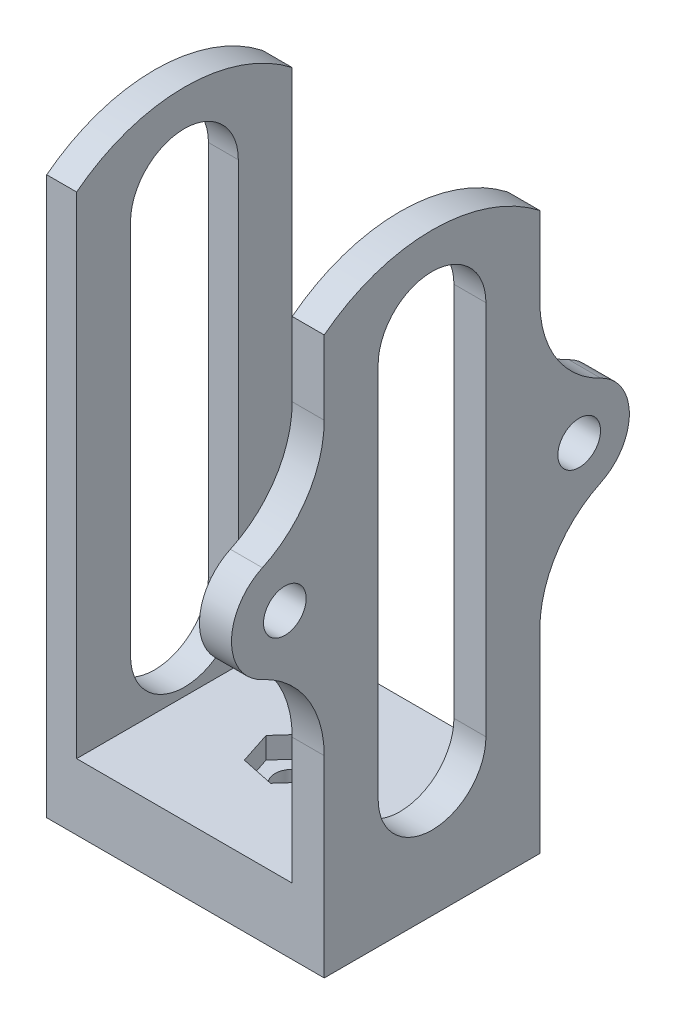
ISO-10303-21;
HEADER;
FILE_DESCRIPTION(('STEP AP214'),'2;1');
FILE_NAME('part.step','',(''),(''),'','','');
FILE_SCHEMA(('AUTOMOTIVE_DESIGN { 1 0 10303 214 1 1 1 1 }'));
ENDSEC;
DATA;
#1=APPLICATION_CONTEXT('core data for automotive mechanical design processes');
#2=APPLICATION_PROTOCOL_DEFINITION('international standard','automotive_design',2000,#1);
#3=PRODUCT_CONTEXT('',#1,'mechanical');
#4=PRODUCT('Part','Part','',(#3));
#5=PRODUCT_RELATED_PRODUCT_CATEGORY('part','',(#4));
#6=PRODUCT_DEFINITION_FORMATION('','',#4);
#7=PRODUCT_DEFINITION_CONTEXT('part definition',#1,'design');
#8=PRODUCT_DEFINITION('design','',#6,#7);
#9=PRODUCT_DEFINITION_SHAPE('','',#8);
#10=(LENGTH_UNIT() NAMED_UNIT(*) SI_UNIT(.MILLI.,.METRE.));
#11=(NAMED_UNIT(*) PLANE_ANGLE_UNIT() SI_UNIT($,.RADIAN.));
#12=(NAMED_UNIT(*) SI_UNIT($,.STERADIAN.) SOLID_ANGLE_UNIT());
#13=UNCERTAINTY_MEASURE_WITH_UNIT(LENGTH_MEASURE(1.E-05),#10,'distance_accuracy_value','');
#14=(GEOMETRIC_REPRESENTATION_CONTEXT(3) GLOBAL_UNCERTAINTY_ASSIGNED_CONTEXT((#13)) GLOBAL_UNIT_ASSIGNED_CONTEXT((#10,
#11,#12)) REPRESENTATION_CONTEXT('',''));
#15=CARTESIAN_POINT('',(0.,0.,0.));
#16=DIRECTION('',(0.,0.,1.));
#17=DIRECTION('',(1.,0.,0.));
#18=AXIS2_PLACEMENT_3D('',#15,#16,#17);
#19=CARTESIAN_POINT('',(23.,18.041981199993,0.));
#20=DIRECTION('',(0.,0.,1.));
#21=DIRECTION('',(0.,-1.,0.));
#22=AXIS2_PLACEMENT_3D('',#19,#20,#21);
#23=PLANE('',#22);
#24=DIRECTION('',(0.,-1.,0.));
#25=VECTOR('',#24,1.);
#26=CARTESIAN_POINT('',(26.,18.041981199993,0.));
#27=LINE('',#26,#25);
#28=CARTESIAN_POINT('',(26.,18.041981199993,0.));
#29=VERTEX_POINT('',#28);
#30=CARTESIAN_POINT('',(26.,-1.17226888093945E-13,0.));
#31=VERTEX_POINT('',#30);
#32=EDGE_CURVE('E312',#29,#31,#27,.T.);
#33=ORIENTED_EDGE('',*,*,#32,.F.);
#34=DIRECTION('',(1.,0.,0.));
#35=VECTOR('',#34,1.);
#36=CARTESIAN_POINT('',(23.,18.041981199993,0.));
#37=LINE('',#36,#35);
#38=CARTESIAN_POINT('',(23.,18.041981199993,0.));
#39=VERTEX_POINT('',#38);
#40=EDGE_CURVE('E44',#39,#29,#37,.T.);
#41=ORIENTED_EDGE('',*,*,#40,.F.);
#42=DIRECTION('',(0.,-1.,0.));
#43=VECTOR('',#42,1.);
#44=CARTESIAN_POINT('',(23.,18.041981199993,0.));
#45=LINE('',#44,#43);
#46=CARTESIAN_POINT('',(23.,6.2,0.));
#47=VERTEX_POINT('',#46);
#48=EDGE_CURVE('E230',#39,#47,#45,.T.);
#49=ORIENTED_EDGE('',*,*,#48,.T.);
#50=DIRECTION('',(1.,0.,0.));
#51=VECTOR('',#50,1.);
#52=CARTESIAN_POINT('',(2.8,6.2,0.));
#53=LINE('',#52,#51);
#54=CARTESIAN_POINT('',(2.8,6.2,0.));
#55=VERTEX_POINT('',#54);
#56=EDGE_CURVE('E227',#55,#47,#53,.T.);
#57=ORIENTED_EDGE('',*,*,#56,.F.);
#58=DIRECTION('',(0.,-1.,0.));
#59=VECTOR('',#58,1.);
#60=CARTESIAN_POINT('',(2.79999999999999,52.1796300253284,0.));
#61=LINE('',#60,#59);
#62=CARTESIAN_POINT('',(2.79999999999999,52.1796300253284,0.));
#63=VERTEX_POINT('',#62);
#64=EDGE_CURVE('E192',#63,#55,#61,.T.);
#65=ORIENTED_EDGE('',*,*,#64,.F.);
#66=DIRECTION('',(1.,0.,0.));
#67=VECTOR('',#66,1.);
#68=CARTESIAN_POINT('',(0.,52.1796300253284,0.));
#69=LINE('',#68,#67);
#70=CARTESIAN_POINT('',(0.,52.1796300253284,0.));
#71=VERTEX_POINT('',#70);
#72=EDGE_CURVE('E206',#71,#63,#69,.T.);
#73=ORIENTED_EDGE('',*,*,#72,.F.);
#74=DIRECTION('',(0.,-1.,0.));
#75=VECTOR('',#74,1.);
#76=CARTESIAN_POINT('',(0.,52.1796300253284,0.));
#77=LINE('',#76,#75);
#78=CARTESIAN_POINT('',(0.,0.,0.));
#79=VERTEX_POINT('',#78);
#80=EDGE_CURVE('E198',#71,#79,#77,.T.);
#81=ORIENTED_EDGE('',*,*,#80,.T.);
#82=DIRECTION('',(1.,0.,0.));
#83=VECTOR('',#82,1.);
#84=CARTESIAN_POINT('',(23.,-1.16110653565093E-13,0.));
#85=LINE('',#84,#83);
#86=EDGE_CURVE('E311',#79,#31,#85,.T.);
#87=ORIENTED_EDGE('',*,*,#86,.T.);
#88=EDGE_LOOP('',(#33,#41,#49,#57,#65,#73,#81,#87));
#89=FACE_BOUND('',#88,.T.);
#90=ADVANCED_FACE('F34',(#89),#23,.T.);
#91=CARTESIAN_POINT('',(23.,18.041981199993,10.));
#92=DIRECTION('',(1.,0.,0.));
#93=DIRECTION('',(0.,0.,-1.));
#94=AXIS2_PLACEMENT_3D('',#91,#92,#93);
#95=CYLINDRICAL_SURFACE('',#94,10.);
#96=CARTESIAN_POINT('',(26.,18.041981199993,10.));
#97=DIRECTION('',(-1.,0.,0.));
#98=DIRECTION('',(0.,0.,-1.));
#99=AXIS2_PLACEMENT_3D('',#96,#97,#98);
#100=CIRCLE('',#99,10.);
#101=CARTESIAN_POINT('',(26.,27.1141339519894,5.79333333333336));
#102=VERTEX_POINT('',#101);
#103=EDGE_CURVE('E284',#102,#29,#100,.T.);
#104=ORIENTED_EDGE('',*,*,#103,.F.);
#105=DIRECTION('',(1.,0.,0.));
#106=VECTOR('',#105,1.);
#107=CARTESIAN_POINT('',(23.,27.1141339519894,5.79333333333335));
#108=LINE('',#107,#106);
#109=CARTESIAN_POINT('',(23.,27.1141339519894,5.79333333333335));
#110=VERTEX_POINT('',#109);
#111=EDGE_CURVE('E350',#110,#102,#108,.T.);
#112=ORIENTED_EDGE('',*,*,#111,.F.);
#113=CARTESIAN_POINT('',(23.,18.041981199993,10.));
#114=DIRECTION('',(-1.,0.,0.));
#115=DIRECTION('',(0.,0.,-1.));
#116=AXIS2_PLACEMENT_3D('',#113,#114,#115);
#117=CIRCLE('',#116,10.);
#118=EDGE_CURVE('E308',#110,#39,#117,.T.);
#119=ORIENTED_EDGE('',*,*,#118,.T.);
#120=ORIENTED_EDGE('',*,*,#40,.T.);
#121=EDGE_LOOP('',(#104,#112,#119,#120));
#122=FACE_BOUND('',#121,.T.);
#123=ADVANCED_FACE('F509',(#122),#95,.F.);
#124=CARTESIAN_POINT('',(23.,31.6502103279876,3.69000000000002));
#125=DIRECTION('',(1.,0.,0.));
#126=DIRECTION('',(0.,0.,-1.));
#127=AXIS2_PLACEMENT_3D('',#124,#125,#126);
#128=CYLINDRICAL_SURFACE('',#127,5.);
#129=CARTESIAN_POINT('',(26.,31.6502103279876,3.69000000000002));
#130=DIRECTION('',(1.,0.,0.));
#131=DIRECTION('',(0.,0.,-1.));
#132=AXIS2_PLACEMENT_3D('',#129,#130,#131);
#133=CIRCLE('',#132,5.);
#134=CARTESIAN_POINT('',(26.,36.1862867039858,5.79333333333335));
#135=VERTEX_POINT('',#134);
#136=EDGE_CURVE('E343',#135,#102,#133,.T.);
#137=ORIENTED_EDGE('',*,*,#136,.F.);
#138=DIRECTION('',(1.,0.,0.));
#139=VECTOR('',#138,1.);
#140=CARTESIAN_POINT('',(23.,36.1862867039858,5.79333333333335));
#141=LINE('',#140,#139);
#142=CARTESIAN_POINT('',(23.,36.1862867039858,5.79333333333335));
#143=VERTEX_POINT('',#142);
#144=EDGE_CURVE('E353',#143,#135,#141,.T.);
#145=ORIENTED_EDGE('',*,*,#144,.F.);
#146=CARTESIAN_POINT('',(23.,31.6502103279876,3.69000000000002));
#147=DIRECTION('',(1.,0.,0.));
#148=DIRECTION('',(0.,0.,-1.));
#149=AXIS2_PLACEMENT_3D('',#146,#147,#148);
#150=CIRCLE('',#149,5.);
#151=EDGE_CURVE('E305',#143,#110,#150,.T.);
#152=ORIENTED_EDGE('',*,*,#151,.T.);
#153=ORIENTED_EDGE('',*,*,#111,.T.);
#154=EDGE_LOOP('',(#137,#145,#152,#153));
#155=FACE_BOUND('',#154,.T.);
#156=ADVANCED_FACE('F512',(#155),#128,.T.);
#157=CARTESIAN_POINT('',(23.,45.2584394559822,10.));
#158=DIRECTION('',(1.,0.,0.));
#159=DIRECTION('',(0.,0.,-1.));
#160=AXIS2_PLACEMENT_3D('',#157,#158,#159);
#161=CYLINDRICAL_SURFACE('',#160,10.);
#162=CARTESIAN_POINT('',(26.,45.2584394559822,10.));
#163=DIRECTION('',(-1.,0.,0.));
#164=DIRECTION('',(0.,0.,1.));
#165=AXIS2_PLACEMENT_3D('',#162,#163,#164);
#166=CIRCLE('',#165,10.);
#167=CARTESIAN_POINT('',(26.,45.2584394559822,0.));
#168=VERTEX_POINT('',#167);
#169=EDGE_CURVE('E340',#168,#135,#166,.T.);
#170=ORIENTED_EDGE('',*,*,#169,.F.);
#171=DIRECTION('',(1.,0.,0.));
#172=VECTOR('',#171,1.);
#173=CARTESIAN_POINT('',(23.,45.2584394559822,0.));
#174=LINE('',#173,#172);
#175=CARTESIAN_POINT('',(23.,45.2584394559822,0.));
#176=VERTEX_POINT('',#175);
#177=EDGE_CURVE('E356',#176,#168,#174,.T.);
#178=ORIENTED_EDGE('',*,*,#177,.F.);
#179=CARTESIAN_POINT('',(23.,45.2584394559822,10.));
#180=DIRECTION('',(-1.,0.,0.));
#181=DIRECTION('',(0.,0.,1.));
#182=AXIS2_PLACEMENT_3D('',#179,#180,#181);
#183=CIRCLE('',#182,10.);
#184=EDGE_CURVE('E302',#176,#143,#183,.T.);
#185=ORIENTED_EDGE('',*,*,#184,.T.);
#186=ORIENTED_EDGE('',*,*,#144,.T.);
#187=EDGE_LOOP('',(#170,#178,#185,#186));
#188=FACE_BOUND('',#187,.T.);
#189=ADVANCED_FACE('F516',(#188),#161,.F.);
#190=CARTESIAN_POINT('',(23.,52.1796300253283,0.));
#191=DIRECTION('',(0.,0.,1.));
#192=DIRECTION('',(0.,-1.,0.));
#193=AXIS2_PLACEMENT_3D('',#190,#191,#192);
#194=PLANE('',#193);
#195=DIRECTION('',(0.,-1.,0.));
#196=VECTOR('',#195,1.);
#197=CARTESIAN_POINT('',(26.,52.1796300253283,0.));
#198=LINE('',#197,#196);
#199=CARTESIAN_POINT('',(26.,52.1796300253283,0.));
#200=VERTEX_POINT('',#199);
#201=EDGE_CURVE('E337',#200,#168,#198,.T.);
#202=ORIENTED_EDGE('',*,*,#201,.F.);
#203=DIRECTION('',(1.,0.,0.));
#204=VECTOR('',#203,1.);
#205=CARTESIAN_POINT('',(23.,52.1796300253283,0.));
#206=LINE('',#205,#204);
#207=CARTESIAN_POINT('',(23.,52.1796300253283,0.));
#208=VERTEX_POINT('',#207);
#209=EDGE_CURVE('E359',#208,#200,#206,.T.);
#210=ORIENTED_EDGE('',*,*,#209,.F.);
#211=DIRECTION('',(0.,-1.,0.));
#212=VECTOR('',#211,1.);
#213=CARTESIAN_POINT('',(23.,52.1796300253283,0.));
#214=LINE('',#213,#212);
#215=EDGE_CURVE('E299',#208,#176,#214,.T.);
#216=ORIENTED_EDGE('',*,*,#215,.T.);
#217=ORIENTED_EDGE('',*,*,#177,.T.);
#218=EDGE_LOOP('',(#202,#210,#216,#217));
#219=FACE_BOUND('',#218,.T.);
#220=ADVANCED_FACE('F520',(#219),#194,.T.);
#221=CARTESIAN_POINT('',(23.,39.1850926484792,-10.1));
#222=DIRECTION('',(1.,0.,0.));
#223=DIRECTION('',(0.,0.,-1.));
#224=AXIS2_PLACEMENT_3D('',#221,#222,#223);
#225=CYLINDRICAL_SURFACE('',#224,16.4580679801224);
#226=CARTESIAN_POINT('',(26.,39.1850926484792,-10.1));
#227=DIRECTION('',(1.,0.,0.));
#228=DIRECTION('',(0.,0.,-1.));
#229=AXIS2_PLACEMENT_3D('',#226,#227,#228);
#230=CIRCLE('',#229,16.4580679801224);
#231=CARTESIAN_POINT('',(26.,52.1796300253283,-20.2));
#232=VERTEX_POINT('',#231);
#233=EDGE_CURVE('E334',#232,#200,#230,.T.);
#234=ORIENTED_EDGE('',*,*,#233,.F.);
#235=DIRECTION('',(1.,0.,0.));
#236=VECTOR('',#235,1.);
#237=CARTESIAN_POINT('',(23.,52.1796300253283,-20.2));
#238=LINE('',#237,#236);
#239=CARTESIAN_POINT('',(23.,52.1796300253283,-20.2));
#240=VERTEX_POINT('',#239);
#241=EDGE_CURVE('E362',#240,#232,#238,.T.);
#242=ORIENTED_EDGE('',*,*,#241,.F.);
#243=CARTESIAN_POINT('',(23.,39.1850926484792,-10.1));
#244=DIRECTION('',(1.,0.,0.));
#245=DIRECTION('',(0.,0.,-1.));
#246=AXIS2_PLACEMENT_3D('',#243,#244,#245);
#247=CIRCLE('',#246,16.4580679801224);
#248=EDGE_CURVE('E296',#240,#208,#247,.T.);
#249=ORIENTED_EDGE('',*,*,#248,.T.);
#250=ORIENTED_EDGE('',*,*,#209,.T.);
#251=EDGE_LOOP('',(#234,#242,#249,#250));
#252=FACE_BOUND('',#251,.T.);
#253=ADVANCED_FACE('F524',(#252),#225,.T.);
#254=CARTESIAN_POINT('',(23.,44.754426549422,-20.2));
#255=DIRECTION('',(0.,0.,-1.));
#256=DIRECTION('',(0.,1.,0.));
#257=AXIS2_PLACEMENT_3D('',#254,#255,#256);
#258=PLANE('',#257);
#259=DIRECTION('',(0.,1.,0.));
#260=VECTOR('',#259,1.);
#261=CARTESIAN_POINT('',(26.,44.754426549422,-20.2));
#262=LINE('',#261,#260);
#263=CARTESIAN_POINT('',(26.,44.754426549422,-20.2));
#264=VERTEX_POINT('',#263);
#265=EDGE_CURVE('E331',#264,#232,#262,.T.);
#266=ORIENTED_EDGE('',*,*,#265,.F.);
#267=DIRECTION('',(1.,0.,0.));
#268=VECTOR('',#267,1.);
#269=CARTESIAN_POINT('',(23.,44.754426549422,-20.2));
#270=LINE('',#269,#268);
#271=CARTESIAN_POINT('',(23.,44.754426549422,-20.2));
#272=VERTEX_POINT('',#271);
#273=EDGE_CURVE('E365',#272,#264,#270,.T.);
#274=ORIENTED_EDGE('',*,*,#273,.F.);
#275=DIRECTION('',(0.,1.,0.));
#276=VECTOR('',#275,1.);
#277=CARTESIAN_POINT('',(23.,44.754426549422,-20.2));
#278=LINE('',#277,#276);
#279=EDGE_CURVE('E293',#272,#240,#278,.T.);
#280=ORIENTED_EDGE('',*,*,#279,.T.);
#281=ORIENTED_EDGE('',*,*,#241,.T.);
#282=EDGE_LOOP('',(#266,#274,#280,#281));
#283=FACE_BOUND('',#282,.T.);
#284=ADVANCED_FACE('F528',(#283),#258,.T.);
#285=CARTESIAN_POINT('',(23.0000000000001,44.754426549422,-30.2));
#286=DIRECTION('',(1.,0.,0.));
#287=DIRECTION('',(0.,0.,-1.));
#288=AXIS2_PLACEMENT_3D('',#285,#286,#287);
#289=CYLINDRICAL_SURFACE('',#288,10.);
#290=CARTESIAN_POINT('',(26.0000000000001,44.754426549422,-30.2));
#291=DIRECTION('',(-1.,0.,0.));
#292=DIRECTION('',(0.,0.,-1.));
#293=AXIS2_PLACEMENT_3D('',#290,#291,#292);
#294=CIRCLE('',#293,10.);
#295=CARTESIAN_POINT('',(26.,35.7229526528202,-25.9066936686277));
#296=VERTEX_POINT('',#295);
#297=EDGE_CURVE('E328',#296,#264,#294,.T.);
#298=ORIENTED_EDGE('',*,*,#297,.F.);
#299=DIRECTION('',(1.,0.,0.));
#300=VECTOR('',#299,1.);
#301=CARTESIAN_POINT('',(23.,35.7229526528202,-25.9066936686277));
#302=LINE('',#301,#300);
#303=CARTESIAN_POINT('',(23.,35.7229526528202,-25.9066936686277));
#304=VERTEX_POINT('',#303);
#305=EDGE_CURVE('E368',#304,#296,#302,.T.);
#306=ORIENTED_EDGE('',*,*,#305,.F.);
#307=CARTESIAN_POINT('',(23.0000000000001,44.754426549422,-30.2));
#308=DIRECTION('',(-1.,0.,0.));
#309=DIRECTION('',(0.,0.,-1.));
#310=AXIS2_PLACEMENT_3D('',#307,#308,#309);
#311=CIRCLE('',#310,10.);
#312=EDGE_CURVE('E290',#304,#272,#311,.T.);
#313=ORIENTED_EDGE('',*,*,#312,.T.);
#314=ORIENTED_EDGE('',*,*,#273,.T.);
#315=EDGE_LOOP('',(#298,#306,#313,#314));
#316=FACE_BOUND('',#315,.T.);
#317=ADVANCED_FACE('F532',(#316),#289,.F.);
#318=CARTESIAN_POINT('',(23.,31.4806007636569,-23.89));
#319=DIRECTION('',(1.,0.,0.));
#320=DIRECTION('',(0.,0.,-1.));
#321=AXIS2_PLACEMENT_3D('',#318,#319,#320);
#322=CYLINDRICAL_SURFACE('',#321,4.69729740431352);
#323=CARTESIAN_POINT('',(26.,31.4806007636569,-23.89));
#324=DIRECTION('',(1.,0.,0.));
#325=DIRECTION('',(0.,0.,-1.));
#326=AXIS2_PLACEMENT_3D('',#323,#324,#325);
#327=CIRCLE('',#326,4.69729740431352);
#328=CARTESIAN_POINT('',(26.,27.2382488744936,-25.9066936686277));
#329=VERTEX_POINT('',#328);
#330=EDGE_CURVE('E325',#329,#296,#327,.T.);
#331=ORIENTED_EDGE('',*,*,#330,.F.);
#332=DIRECTION('',(1.,0.,0.));
#333=VECTOR('',#332,1.);
#334=CARTESIAN_POINT('',(23.,27.2382488744936,-25.9066936686277));
#335=LINE('',#334,#333);
#336=CARTESIAN_POINT('',(23.,27.2382488744936,-25.9066936686277));
#337=VERTEX_POINT('',#336);
#338=EDGE_CURVE('E371',#337,#329,#335,.T.);
#339=ORIENTED_EDGE('',*,*,#338,.F.);
#340=CARTESIAN_POINT('',(23.,31.4806007636569,-23.89));
#341=DIRECTION('',(1.,0.,0.));
#342=DIRECTION('',(0.,0.,-1.));
#343=AXIS2_PLACEMENT_3D('',#340,#341,#342);
#344=CIRCLE('',#343,4.69729740431352);
#345=EDGE_CURVE('E282',#337,#304,#344,.T.);
#346=ORIENTED_EDGE('',*,*,#345,.T.);
#347=ORIENTED_EDGE('',*,*,#305,.T.);
#348=EDGE_LOOP('',(#331,#339,#346,#347));
#349=FACE_BOUND('',#348,.T.);
#350=ADVANCED_FACE('F536',(#349),#322,.T.);
#351=CARTESIAN_POINT('',(23.,18.2067749778919,-30.2));
#352=DIRECTION('',(1.,0.,0.));
#353=DIRECTION('',(0.,0.,-1.));
#354=AXIS2_PLACEMENT_3D('',#351,#352,#353);
#355=CYLINDRICAL_SURFACE('',#354,10.);
#356=CARTESIAN_POINT('',(26.,18.2067749778919,-30.2));
#357=DIRECTION('',(-1.,0.,0.));
#358=DIRECTION('',(0.,0.,1.));
#359=AXIS2_PLACEMENT_3D('',#356,#357,#358);
#360=CIRCLE('',#359,10.);
#361=CARTESIAN_POINT('',(26.,18.2067749778919,-20.2));
#362=VERTEX_POINT('',#361);
#363=EDGE_CURVE('E322',#362,#329,#360,.T.);
#364=ORIENTED_EDGE('',*,*,#363,.F.);
#365=DIRECTION('',(1.,0.,0.));
#366=VECTOR('',#365,1.);
#367=CARTESIAN_POINT('',(23.,18.2067749778919,-20.2));
#368=LINE('',#367,#366);
#369=CARTESIAN_POINT('',(23.,18.2067749778919,-20.2));
#370=VERTEX_POINT('',#369);
#371=EDGE_CURVE('E374',#370,#362,#368,.T.);
#372=ORIENTED_EDGE('',*,*,#371,.F.);
#373=CARTESIAN_POINT('',(23.,18.2067749778919,-30.2));
#374=DIRECTION('',(-1.,0.,0.));
#375=DIRECTION('',(0.,0.,1.));
#376=AXIS2_PLACEMENT_3D('',#373,#374,#375);
#377=CIRCLE('',#376,10.);
#378=EDGE_CURVE('E280',#370,#337,#377,.T.);
#379=ORIENTED_EDGE('',*,*,#378,.T.);
#380=ORIENTED_EDGE('',*,*,#338,.T.);
#381=EDGE_LOOP('',(#364,#372,#379,#380));
#382=FACE_BOUND('',#381,.T.);
#383=ADVANCED_FACE('F540',(#382),#355,.F.);
#384=CARTESIAN_POINT('',(23.,-1.2171727983945E-13,-20.1999999999999));
#385=DIRECTION('',(0.,0.,-1.));
#386=DIRECTION('',(0.,1.,0.));
#387=AXIS2_PLACEMENT_3D('',#384,#385,#386);
#388=PLANE('',#387);
#389=DIRECTION('',(0.,1.,0.));
#390=VECTOR('',#389,1.);
#391=CARTESIAN_POINT('',(26.,-1.22833514368302E-13,-20.1999999999999));
#392=LINE('',#391,#390);
#393=CARTESIAN_POINT('',(26.,-1.22833514368302E-13,-20.1999999999999));
#394=VERTEX_POINT('',#393);
#395=EDGE_CURVE('E319',#394,#362,#392,.T.);
#396=ORIENTED_EDGE('',*,*,#395,.F.);
#397=DIRECTION('',(1.,0.,0.));
#398=VECTOR('',#397,1.);
#399=CARTESIAN_POINT('',(23.,-1.2171727983945E-13,-20.1999999999999));
#400=LINE('',#399,#398);
#401=CARTESIAN_POINT('',(0.,0.,-20.2));
#402=VERTEX_POINT('',#401);
#403=EDGE_CURVE('E376',#402,#394,#400,.T.);
#404=ORIENTED_EDGE('',*,*,#403,.F.);
#405=DIRECTION('',(0.,1.,0.));
#406=VECTOR('',#405,1.);
#407=CARTESIAN_POINT('',(0.,0.,-20.2));
#408=LINE('',#407,#406);
#409=CARTESIAN_POINT('',(0.,52.1796300253284,-20.2));
#410=VERTEX_POINT('',#409);
#411=EDGE_CURVE('E191',#402,#410,#408,.T.);
#412=ORIENTED_EDGE('',*,*,#411,.T.);
#413=DIRECTION('',(1.,0.,0.));
#414=VECTOR('',#413,1.);
#415=CARTESIAN_POINT('',(0.,52.1796300253284,-20.2));
#416=LINE('',#415,#414);
#417=CARTESIAN_POINT('',(2.79999999999999,52.1796300253284,-20.2));
#418=VERTEX_POINT('',#417);
#419=EDGE_CURVE('E38',#410,#418,#416,.T.);
#420=ORIENTED_EDGE('',*,*,#419,.T.);
#421=DIRECTION('',(0.,1.,0.));
#422=VECTOR('',#421,1.);
#423=CARTESIAN_POINT('',(2.79999999999999,0.,-20.2));
#424=LINE('',#423,#422);
#425=CARTESIAN_POINT('',(2.8,6.2,-20.2));
#426=VERTEX_POINT('',#425);
#427=EDGE_CURVE('E185',#426,#418,#424,.T.);
#428=ORIENTED_EDGE('',*,*,#427,.F.);
#429=DIRECTION('',(-1.,0.,0.));
#430=VECTOR('',#429,1.);
#431=CARTESIAN_POINT('',(23.,6.2,-20.2));
#432=LINE('',#431,#430);
#433=CARTESIAN_POINT('',(23.,6.2,-20.2));
#434=VERTEX_POINT('',#433);
#435=EDGE_CURVE('E237',#434,#426,#432,.T.);
#436=ORIENTED_EDGE('',*,*,#435,.F.);
#437=DIRECTION('',(0.,1.,0.));
#438=VECTOR('',#437,1.);
#439=CARTESIAN_POINT('',(23.,-1.2171727983945E-13,-20.1999999999999));
#440=LINE('',#439,#438);
#441=EDGE_CURVE('E272',#434,#370,#440,.T.);
#442=ORIENTED_EDGE('',*,*,#441,.T.);
#443=ORIENTED_EDGE('',*,*,#371,.T.);
#444=EDGE_LOOP('',(#396,#404,#412,#420,#428,#436,#442,#443));
#445=FACE_BOUND('',#444,.T.);
#446=ADVANCED_FACE('F216',(#445),#388,.T.);
#447=CARTESIAN_POINT('',(23.,-1.16110653565093E-13,0.));
#448=DIRECTION('',(0.,-1.,0.));
#449=DIRECTION('',(-1.,0.,0.));
#450=AXIS2_PLACEMENT_3D('',#447,#448,#449);
#451=PLANE('',#450);
#452=DIRECTION('',(0.,0.,-1.));
#453=VECTOR('',#452,1.);
#454=CARTESIAN_POINT('',(26.,-1.17226888093945E-13,0.));
#455=LINE('',#454,#453);
#456=EDGE_CURVE('E315',#31,#394,#455,.T.);
#457=ORIENTED_EDGE('',*,*,#456,.F.);
#458=ORIENTED_EDGE('',*,*,#86,.F.);
#459=DIRECTION('',(0.,0.,-1.));
#460=VECTOR('',#459,1.);
#461=CARTESIAN_POINT('',(0.,0.,0.));
#462=LINE('',#461,#460);
#463=EDGE_CURVE('E188',#79,#402,#462,.T.);
#464=ORIENTED_EDGE('',*,*,#463,.T.);
#465=ORIENTED_EDGE('',*,*,#403,.T.);
#466=EDGE_LOOP('',(#457,#458,#464,#465));
#467=FACE_BOUND('',#466,.T.);
#468=CARTESIAN_POINT('',(12.9,0.,-10.1));
#469=DIRECTION('',(0.,1.,0.));
#470=DIRECTION('',(1.,0.,0.));
#471=AXIS2_PLACEMENT_3D('',#468,#469,#470);
#472=CIRCLE('',#471,1.59999999999999);
#473=CARTESIAN_POINT('',(14.5,0.,-10.1));
#474=VERTEX_POINT('',#473);
#475=EDGE_CURVE('E242',#474,#474,#472,.T.);
#476=ORIENTED_EDGE('',*,*,#475,.T.);
#477=EDGE_LOOP('',(#476));
#478=FACE_BOUND('',#477,.T.);
#479=ADVANCED_FACE('F505',(#467,#478),#451,.T.);
#480=CARTESIAN_POINT('',(23.,18.2067749778919,-30.2));
#481=DIRECTION('',(-1.,0.,0.));
#482=DIRECTION('',(0.,0.,1.));
#483=AXIS2_PLACEMENT_3D('',#480,#481,#482);
#484=PLANE('',#483);
#485=DIRECTION('',(0.,0.,-1.));
#486=VECTOR('',#485,1.);
#487=CARTESIAN_POINT('',(23.,6.2,0.));
#488=LINE('',#487,#486);
#489=EDGE_CURVE('E11',#47,#434,#488,.T.);
#490=ORIENTED_EDGE('',*,*,#489,.F.);
#491=ORIENTED_EDGE('',*,*,#48,.F.);
#492=ORIENTED_EDGE('',*,*,#118,.F.);
#493=ORIENTED_EDGE('',*,*,#151,.F.);
#494=ORIENTED_EDGE('',*,*,#184,.F.);
#495=ORIENTED_EDGE('',*,*,#215,.F.);
#496=ORIENTED_EDGE('',*,*,#248,.F.);
#497=ORIENTED_EDGE('',*,*,#279,.F.);
#498=ORIENTED_EDGE('',*,*,#312,.F.);
#499=ORIENTED_EDGE('',*,*,#345,.F.);
#500=ORIENTED_EDGE('',*,*,#378,.F.);
#501=ORIENTED_EDGE('',*,*,#441,.F.);
#502=EDGE_LOOP('',(#490,#491,#492,#493,#494,#495,#496,#497,#498,#499,#500,#501));
#503=FACE_BOUND('',#502,.T.);
#504=CARTESIAN_POINT('',(23.,31.4806007636569,-23.89));
#505=DIRECTION('',(1.,0.,0.));
#506=DIRECTION('',(0.,0.,-1.));
#507=AXIS2_PLACEMENT_3D('',#504,#505,#506);
#508=CIRCLE('',#507,1.99999999999986);
#509=CARTESIAN_POINT('',(23.,31.4806007636569,-25.8899999999998));
#510=VERTEX_POINT('',#509);
#511=EDGE_CURVE('E235',#510,#510,#508,.T.);
#512=ORIENTED_EDGE('',*,*,#511,.T.);
#513=EDGE_LOOP('',(#512));
#514=FACE_BOUND('',#513,.T.);
#515=CARTESIAN_POINT('',(23.,31.6502103279876,3.69000000000002));
#516=DIRECTION('',(1.,0.,0.));
#517=DIRECTION('',(0.,0.,-1.));
#518=AXIS2_PLACEMENT_3D('',#515,#516,#517);
#519=CIRCLE('',#518,2.);
#520=CARTESIAN_POINT('',(23.,31.6502103279876,1.69000000000002));
#521=VERTEX_POINT('',#520);
#522=EDGE_CURVE('E838',#521,#521,#519,.T.);
#523=ORIENTED_EDGE('',*,*,#522,.T.);
#524=EDGE_LOOP('',(#523));
#525=FACE_BOUND('',#524,.T.);
#526=CARTESIAN_POINT('',(23.,12.,-10.1));
#527=DIRECTION('',(1.,0.,0.));
#528=DIRECTION('',(0.,0.,-1.));
#529=AXIS2_PLACEMENT_3D('',#526,#527,#528);
#530=CIRCLE('',#529,5.05);
#531=CARTESIAN_POINT('',(23.,12.,-5.04999999999998));
#532=VERTEX_POINT('',#531);
#533=CARTESIAN_POINT('',(23.,12.,-15.15));
#534=VERTEX_POINT('',#533);
#535=EDGE_CURVE('E829',#532,#534,#530,.T.);
#536=ORIENTED_EDGE('',*,*,#535,.T.);
#537=DIRECTION('',(0.,1.,0.));
#538=VECTOR('',#537,1.);
#539=CARTESIAN_POINT('',(23.,12.,-15.15));
#540=LINE('',#539,#538);
#541=CARTESIAN_POINT('',(23.,47.2223420938085,-15.15));
#542=VERTEX_POINT('',#541);
#543=EDGE_CURVE('E817',#534,#542,#540,.T.);
#544=ORIENTED_EDGE('',*,*,#543,.T.);
#545=CARTESIAN_POINT('',(23.,47.2223420938085,-10.1));
#546=DIRECTION('',(1.,0.,0.));
#547=DIRECTION('',(0.,0.,-1.));
#548=AXIS2_PLACEMENT_3D('',#545,#546,#547);
#549=CIRCLE('',#548,5.04999999999999);
#550=CARTESIAN_POINT('',(23.,47.2223420938085,-5.05000000000001));
#551=VERTEX_POINT('',#550);
#552=EDGE_CURVE('E804',#542,#551,#549,.T.);
#553=ORIENTED_EDGE('',*,*,#552,.T.);
#554=DIRECTION('',(0.,-1.,0.));
#555=VECTOR('',#554,1.);
#556=CARTESIAN_POINT('',(23.,47.2223420938085,-5.05000000000001));
#557=LINE('',#556,#555);
#558=EDGE_CURVE('E816',#551,#532,#557,.T.);
#559=ORIENTED_EDGE('',*,*,#558,.T.);
#560=EDGE_LOOP('',(#536,#544,#553,#559));
#561=FACE_BOUND('',#560,.T.);
#562=ADVANCED_FACE('F276',(#503,#514,#525,#561),#484,.T.);
#563=CARTESIAN_POINT('',(26.,18.2067749778919,-30.2));
#564=DIRECTION('',(-1.,0.,0.));
#565=DIRECTION('',(0.,0.,1.));
#566=AXIS2_PLACEMENT_3D('',#563,#564,#565);
#567=PLANE('',#566);
#568=CARTESIAN_POINT('',(26.,31.4806007636569,-23.89));
#569=DIRECTION('',(1.,0.,0.));
#570=DIRECTION('',(0.,0.,-1.));
#571=AXIS2_PLACEMENT_3D('',#568,#569,#570);
#572=CIRCLE('',#571,1.99999999999986);
#573=CARTESIAN_POINT('',(26.,31.4806007636569,-25.8899999999998));
#574=VERTEX_POINT('',#573);
#575=EDGE_CURVE('E231',#574,#574,#572,.T.);
#576=ORIENTED_EDGE('',*,*,#575,.F.);
#577=EDGE_LOOP('',(#576));
#578=FACE_BOUND('',#577,.T.);
#579=CARTESIAN_POINT('',(26.,31.6502103279876,3.69000000000002));
#580=DIRECTION('',(1.,0.,0.));
#581=DIRECTION('',(0.,0.,-1.));
#582=AXIS2_PLACEMENT_3D('',#579,#580,#581);
#583=CIRCLE('',#582,2.);
#584=CARTESIAN_POINT('',(26.,31.6502103279876,1.69000000000002));
#585=VERTEX_POINT('',#584);
#586=EDGE_CURVE('E915',#585,#585,#583,.T.);
#587=ORIENTED_EDGE('',*,*,#586,.F.);
#588=EDGE_LOOP('',(#587));
#589=FACE_BOUND('',#588,.T.);
#590=DIRECTION('',(0.,1.,0.));
#591=VECTOR('',#590,1.);
#592=CARTESIAN_POINT('',(26.,12.,-15.15));
#593=LINE('',#592,#591);
#594=CARTESIAN_POINT('',(26.,12.,-15.15));
#595=VERTEX_POINT('',#594);
#596=CARTESIAN_POINT('',(26.,47.2223420938085,-15.15));
#597=VERTEX_POINT('',#596);
#598=EDGE_CURVE('E824',#595,#597,#593,.T.);
#599=ORIENTED_EDGE('',*,*,#598,.F.);
#600=CARTESIAN_POINT('',(26.,12.,-10.1));
#601=DIRECTION('',(1.,0.,0.));
#602=DIRECTION('',(0.,0.,-1.));
#603=AXIS2_PLACEMENT_3D('',#600,#601,#602);
#604=CIRCLE('',#603,5.05);
#605=CARTESIAN_POINT('',(26.,12.,-5.04999999999997));
#606=VERTEX_POINT('',#605);
#607=EDGE_CURVE('E836',#606,#595,#604,.T.);
#608=ORIENTED_EDGE('',*,*,#607,.F.);
#609=DIRECTION('',(0.,-1.,0.));
#610=VECTOR('',#609,1.);
#611=CARTESIAN_POINT('',(26.,47.2223420938085,-5.05000000000001));
#612=LINE('',#611,#610);
#613=CARTESIAN_POINT('',(26.,47.2223420938085,-5.05000000000001));
#614=VERTEX_POINT('',#613);
#615=EDGE_CURVE('E831',#614,#606,#612,.T.);
#616=ORIENTED_EDGE('',*,*,#615,.F.);
#617=CARTESIAN_POINT('',(26.,47.2223420938085,-10.1));
#618=DIRECTION('',(1.,0.,0.));
#619=DIRECTION('',(0.,0.,-1.));
#620=AXIS2_PLACEMENT_3D('',#617,#618,#619);
#621=CIRCLE('',#620,5.04999999999999);
#622=EDGE_CURVE('E840',#597,#614,#621,.T.);
#623=ORIENTED_EDGE('',*,*,#622,.F.);
#624=EDGE_LOOP('',(#599,#608,#616,#623));
#625=FACE_BOUND('',#624,.T.);
#626=ORIENTED_EDGE('',*,*,#32,.T.);
#627=ORIENTED_EDGE('',*,*,#456,.T.);
#628=ORIENTED_EDGE('',*,*,#395,.T.);
#629=ORIENTED_EDGE('',*,*,#363,.T.);
#630=ORIENTED_EDGE('',*,*,#330,.T.);
#631=ORIENTED_EDGE('',*,*,#297,.T.);
#632=ORIENTED_EDGE('',*,*,#265,.T.);
#633=ORIENTED_EDGE('',*,*,#233,.T.);
#634=ORIENTED_EDGE('',*,*,#201,.T.);
#635=ORIENTED_EDGE('',*,*,#169,.T.);
#636=ORIENTED_EDGE('',*,*,#136,.T.);
#637=ORIENTED_EDGE('',*,*,#103,.T.);
#638=EDGE_LOOP('',(#626,#627,#628,#629,#630,#631,#632,#633,#634,#635,#636,#637));
#639=FACE_BOUND('',#638,.T.);
#640=ADVANCED_FACE('F501',(#578,#589,#625,#639),#567,.F.);
#641=CARTESIAN_POINT('',(23.,12.,-10.1));
#642=DIRECTION('',(1.,0.,0.));
#643=DIRECTION('',(0.,0.,-1.));
#644=AXIS2_PLACEMENT_3D('',#641,#642,#643);
#645=CYLINDRICAL_SURFACE('',#644,5.05);
#646=ORIENTED_EDGE('',*,*,#607,.T.);
#647=DIRECTION('',(1.,0.,0.));
#648=VECTOR('',#647,1.);
#649=CARTESIAN_POINT('',(23.,12.,-15.15));
#650=LINE('',#649,#648);
#651=EDGE_CURVE('E826',#534,#595,#650,.T.);
#652=ORIENTED_EDGE('',*,*,#651,.F.);
#653=ORIENTED_EDGE('',*,*,#535,.F.);
#654=DIRECTION('',(1.,0.,0.));
#655=VECTOR('',#654,1.);
#656=CARTESIAN_POINT('',(23.,12.,-5.04999999999998));
#657=LINE('',#656,#655);
#658=EDGE_CURVE('E316',#532,#606,#657,.T.);
#659=ORIENTED_EDGE('',*,*,#658,.T.);
#660=EDGE_LOOP('',(#646,#652,#653,#659));
#661=FACE_BOUND('',#660,.T.);
#662=ADVANCED_FACE('F491',(#661),#645,.F.);
#663=CARTESIAN_POINT('',(23.,47.2223420938085,-5.05000000000001));
#664=DIRECTION('',(0.,0.,1.));
#665=DIRECTION('',(0.,-1.,0.));
#666=AXIS2_PLACEMENT_3D('',#663,#664,#665);
#667=PLANE('',#666);
#668=ORIENTED_EDGE('',*,*,#615,.T.);
#669=ORIENTED_EDGE('',*,*,#658,.F.);
#670=ORIENTED_EDGE('',*,*,#558,.F.);
#671=DIRECTION('',(1.,0.,0.));
#672=VECTOR('',#671,1.);
#673=CARTESIAN_POINT('',(23.,47.2223420938085,-5.05000000000001));
#674=LINE('',#673,#672);
#675=EDGE_CURVE('E811',#551,#614,#674,.T.);
#676=ORIENTED_EDGE('',*,*,#675,.T.);
#677=EDGE_LOOP('',(#668,#669,#670,#676));
#678=FACE_BOUND('',#677,.T.);
#679=ADVANCED_FACE('F487',(#678),#667,.F.);
#680=CARTESIAN_POINT('',(23.,47.2223420938085,-10.1));
#681=DIRECTION('',(1.,0.,0.));
#682=DIRECTION('',(0.,0.,-1.));
#683=AXIS2_PLACEMENT_3D('',#680,#681,#682);
#684=CYLINDRICAL_SURFACE('',#683,5.04999999999999);
#685=ORIENTED_EDGE('',*,*,#622,.T.);
#686=ORIENTED_EDGE('',*,*,#675,.F.);
#687=ORIENTED_EDGE('',*,*,#552,.F.);
#688=DIRECTION('',(1.,0.,0.));
#689=VECTOR('',#688,1.);
#690=CARTESIAN_POINT('',(23.,47.2223420938085,-15.15));
#691=LINE('',#690,#689);
#692=EDGE_CURVE('E807',#542,#597,#691,.T.);
#693=ORIENTED_EDGE('',*,*,#692,.T.);
#694=EDGE_LOOP('',(#685,#686,#687,#693));
#695=FACE_BOUND('',#694,.T.);
#696=ADVANCED_FACE('F490',(#695),#684,.F.);
#697=CARTESIAN_POINT('',(23.,12.,-15.15));
#698=DIRECTION('',(0.,0.,-1.));
#699=DIRECTION('',(0.,1.,0.));
#700=AXIS2_PLACEMENT_3D('',#697,#698,#699);
#701=PLANE('',#700);
#702=ORIENTED_EDGE('',*,*,#598,.T.);
#703=ORIENTED_EDGE('',*,*,#692,.F.);
#704=ORIENTED_EDGE('',*,*,#543,.F.);
#705=ORIENTED_EDGE('',*,*,#651,.T.);
#706=EDGE_LOOP('',(#702,#703,#704,#705));
#707=FACE_BOUND('',#706,.T.);
#708=ADVANCED_FACE('F481',(#707),#701,.F.);
#709=CARTESIAN_POINT('',(23.,31.6502103279876,3.69000000000002));
#710=DIRECTION('',(1.,0.,0.));
#711=DIRECTION('',(0.,0.,-1.));
#712=AXIS2_PLACEMENT_3D('',#709,#710,#711);
#713=CYLINDRICAL_SURFACE('',#712,2.);
#714=ORIENTED_EDGE('',*,*,#522,.F.);
#715=EDGE_LOOP('',(#714));
#716=FACE_BOUND('',#715,.T.);
#717=ORIENTED_EDGE('',*,*,#586,.T.);
#718=EDGE_LOOP('',(#717));
#719=FACE_BOUND('',#718,.T.);
#720=ADVANCED_FACE('F475',(#716,#719),#713,.F.);
#721=CARTESIAN_POINT('',(23.,31.4806007636569,-23.89));
#722=DIRECTION('',(1.,0.,0.));
#723=DIRECTION('',(0.,0.,-1.));
#724=AXIS2_PLACEMENT_3D('',#721,#722,#723);
#725=CYLINDRICAL_SURFACE('',#724,1.99999999999986);
#726=ORIENTED_EDGE('',*,*,#511,.F.);
#727=EDGE_LOOP('',(#726));
#728=FACE_BOUND('',#727,.T.);
#729=ORIENTED_EDGE('',*,*,#575,.T.);
#730=EDGE_LOOP('',(#729));
#731=FACE_BOUND('',#730,.T.);
#732=ADVANCED_FACE('F471',(#728,#731),#725,.F.);
#733=CARTESIAN_POINT('',(0.,39.1850926484793,-10.1));
#734=DIRECTION('',(-1.,0.,0.));
#735=DIRECTION('',(0.,0.,1.));
#736=AXIS2_PLACEMENT_3D('',#733,#734,#735);
#737=PLANE('',#736);
#738=CARTESIAN_POINT('',(0.,47.2223420938085,-10.1));
#739=DIRECTION('',(1.,0.,0.));
#740=DIRECTION('',(0.,0.,1.));
#741=AXIS2_PLACEMENT_3D('',#738,#739,#740);
#742=CIRCLE('',#741,5.04999999999999);
#743=CARTESIAN_POINT('',(0.,47.2223420938085,-15.15));
#744=VERTEX_POINT('',#743);
#745=CARTESIAN_POINT('',(0.,47.2223420938085,-5.05000000000004));
#746=VERTEX_POINT('',#745);
#747=EDGE_CURVE('E170',#744,#746,#742,.T.);
#748=ORIENTED_EDGE('',*,*,#747,.T.);
#749=DIRECTION('',(0.,-1.,0.));
#750=VECTOR('',#749,1.);
#751=CARTESIAN_POINT('',(0.,12.,-5.05));
#752=LINE('',#751,#750);
#753=CARTESIAN_POINT('',(0.,12.,-5.05));
#754=VERTEX_POINT('',#753);
#755=EDGE_CURVE('E156',#746,#754,#752,.T.);
#756=ORIENTED_EDGE('',*,*,#755,.T.);
#757=CARTESIAN_POINT('',(0.,12.,-10.1));
#758=DIRECTION('',(1.,0.,0.));
#759=DIRECTION('',(0.,0.,1.));
#760=AXIS2_PLACEMENT_3D('',#757,#758,#759);
#761=CIRCLE('',#760,5.05);
#762=CARTESIAN_POINT('',(0.,12.,-15.15));
#763=VERTEX_POINT('',#762);
#764=EDGE_CURVE('E144',#754,#763,#761,.T.);
#765=ORIENTED_EDGE('',*,*,#764,.T.);
#766=DIRECTION('',(0.,1.,0.));
#767=VECTOR('',#766,1.);
#768=CARTESIAN_POINT('',(0.,47.2223420938085,-15.15));
#769=LINE('',#768,#767);
#770=EDGE_CURVE('E155',#763,#744,#769,.T.);
#771=ORIENTED_EDGE('',*,*,#770,.T.);
#772=EDGE_LOOP('',(#748,#756,#765,#771));
#773=FACE_BOUND('',#772,.T.);
#774=ORIENTED_EDGE('',*,*,#463,.F.);
#775=ORIENTED_EDGE('',*,*,#80,.F.);
#776=CARTESIAN_POINT('',(0.,39.1850926484793,-10.1));
#777=DIRECTION('',(1.,0.,0.));
#778=DIRECTION('',(0.,0.,1.));
#779=AXIS2_PLACEMENT_3D('',#776,#777,#778);
#780=CIRCLE('',#779,16.4580679801224);
#781=EDGE_CURVE('E195',#410,#71,#780,.T.);
#782=ORIENTED_EDGE('',*,*,#781,.F.);
#783=ORIENTED_EDGE('',*,*,#411,.F.);
#784=EDGE_LOOP('',(#774,#775,#782,#783));
#785=FACE_BOUND('',#784,.T.);
#786=ADVANCED_FACE('F167',(#773,#785),#737,.T.);
#787=CARTESIAN_POINT('',(0.,12.,-10.1));
#788=DIRECTION('',(1.,0.,0.));
#789=DIRECTION('',(0.,0.,-1.));
#790=AXIS2_PLACEMENT_3D('',#787,#788,#789);
#791=CYLINDRICAL_SURFACE('',#790,5.05);
#792=CARTESIAN_POINT('',(2.8,12.,-10.1));
#793=DIRECTION('',(1.,0.,0.));
#794=DIRECTION('',(0.,0.,1.));
#795=AXIS2_PLACEMENT_3D('',#792,#793,#794);
#796=CIRCLE('',#795,5.05);
#797=CARTESIAN_POINT('',(2.8,12.,-5.05000000000001));
#798=VERTEX_POINT('',#797);
#799=CARTESIAN_POINT('',(2.79999999999999,12.,-15.15));
#800=VERTEX_POINT('',#799);
#801=EDGE_CURVE('E179',#798,#800,#796,.T.);
#802=ORIENTED_EDGE('',*,*,#801,.T.);
#803=DIRECTION('',(1.,0.,0.));
#804=VECTOR('',#803,1.);
#805=CARTESIAN_POINT('',(0.,12.,-15.15));
#806=LINE('',#805,#804);
#807=EDGE_CURVE('E150',#763,#800,#806,.T.);
#808=ORIENTED_EDGE('',*,*,#807,.F.);
#809=ORIENTED_EDGE('',*,*,#764,.F.);
#810=DIRECTION('',(1.,0.,0.));
#811=VECTOR('',#810,1.);
#812=CARTESIAN_POINT('',(0.,12.,-5.05));
#813=LINE('',#812,#811);
#814=EDGE_CURVE('E148',#754,#798,#813,.T.);
#815=ORIENTED_EDGE('',*,*,#814,.T.);
#816=EDGE_LOOP('',(#802,#808,#809,#815));
#817=FACE_BOUND('',#816,.T.);
#818=ADVANCED_FACE('F147',(#817),#791,.F.);
#819=CARTESIAN_POINT('',(0.,47.2223420938085,-15.15));
#820=DIRECTION('',(0.,0.,-1.));
#821=DIRECTION('',(0.,1.,0.));
#822=AXIS2_PLACEMENT_3D('',#819,#820,#821);
#823=PLANE('',#822);
#824=DIRECTION('',(0.,1.,0.));
#825=VECTOR('',#824,1.);
#826=CARTESIAN_POINT('',(2.79999999999999,47.2223420938085,-15.15));
#827=LINE('',#826,#825);
#828=CARTESIAN_POINT('',(2.79999999999999,47.2223420938085,-15.15));
#829=VERTEX_POINT('',#828);
#830=EDGE_CURVE('E172',#800,#829,#827,.T.);
#831=ORIENTED_EDGE('',*,*,#830,.T.);
#832=DIRECTION('',(1.,0.,0.));
#833=VECTOR('',#832,1.);
#834=CARTESIAN_POINT('',(0.,47.2223420938085,-15.15));
#835=LINE('',#834,#833);
#836=EDGE_CURVE('E183',#744,#829,#835,.T.);
#837=ORIENTED_EDGE('',*,*,#836,.F.);
#838=ORIENTED_EDGE('',*,*,#770,.F.);
#839=ORIENTED_EDGE('',*,*,#807,.T.);
#840=EDGE_LOOP('',(#831,#837,#838,#839));
#841=FACE_BOUND('',#840,.T.);
#842=ADVANCED_FACE('F460',(#841),#823,.F.);
#843=CARTESIAN_POINT('',(0.,47.2223420938085,-10.1));
#844=DIRECTION('',(1.,0.,0.));
#845=DIRECTION('',(0.,0.,-1.));
#846=AXIS2_PLACEMENT_3D('',#843,#844,#845);
#847=CYLINDRICAL_SURFACE('',#846,5.04999999999999);
#848=CARTESIAN_POINT('',(2.79999999999999,47.2223420938085,-10.1));
#849=DIRECTION('',(1.,0.,0.));
#850=DIRECTION('',(0.,0.,1.));
#851=AXIS2_PLACEMENT_3D('',#848,#849,#850);
#852=CIRCLE('',#851,5.04999999999999);
#853=CARTESIAN_POINT('',(2.79999999999999,47.2223420938085,-5.05000000000004));
#854=VERTEX_POINT('',#853);
#855=EDGE_CURVE('E139',#829,#854,#852,.T.);
#856=ORIENTED_EDGE('',*,*,#855,.T.);
#857=DIRECTION('',(1.,0.,0.));
#858=VECTOR('',#857,1.);
#859=CARTESIAN_POINT('',(0.,47.2223420938085,-5.05000000000004));
#860=LINE('',#859,#858);
#861=EDGE_CURVE('E165',#746,#854,#860,.T.);
#862=ORIENTED_EDGE('',*,*,#861,.F.);
#863=ORIENTED_EDGE('',*,*,#747,.F.);
#864=ORIENTED_EDGE('',*,*,#836,.T.);
#865=EDGE_LOOP('',(#856,#862,#863,#864));
#866=FACE_BOUND('',#865,.T.);
#867=ADVANCED_FACE('F448',(#866),#847,.F.);
#868=CARTESIAN_POINT('',(0.,12.,-5.05));
#869=DIRECTION('',(0.,0.,1.));
#870=DIRECTION('',(0.,-1.,0.));
#871=AXIS2_PLACEMENT_3D('',#868,#869,#870);
#872=PLANE('',#871);
#873=DIRECTION('',(0.,-1.,0.));
#874=VECTOR('',#873,1.);
#875=CARTESIAN_POINT('',(2.8,12.,-5.05000000000001));
#876=LINE('',#875,#874);
#877=EDGE_CURVE('E163',#854,#798,#876,.T.);
#878=ORIENTED_EDGE('',*,*,#877,.T.);
#879=ORIENTED_EDGE('',*,*,#814,.F.);
#880=ORIENTED_EDGE('',*,*,#755,.F.);
#881=ORIENTED_EDGE('',*,*,#861,.T.);
#882=EDGE_LOOP('',(#878,#879,#880,#881));
#883=FACE_BOUND('',#882,.T.);
#884=ADVANCED_FACE('F160',(#883),#872,.F.);
#885=CARTESIAN_POINT('',(0.,39.1850926484793,-10.1));
#886=DIRECTION('',(1.,0.,0.));
#887=DIRECTION('',(0.,0.,-1.));
#888=AXIS2_PLACEMENT_3D('',#885,#886,#887);
#889=CYLINDRICAL_SURFACE('',#888,16.4580679801224);
#890=CARTESIAN_POINT('',(2.79999999999999,39.1850926484793,-10.1));
#891=DIRECTION('',(1.,0.,0.));
#892=DIRECTION('',(0.,0.,1.));
#893=AXIS2_PLACEMENT_3D('',#890,#891,#892);
#894=CIRCLE('',#893,16.4580679801224);
#895=EDGE_CURVE('E202',#418,#63,#894,.T.);
#896=ORIENTED_EDGE('',*,*,#895,.F.);
#897=ORIENTED_EDGE('',*,*,#419,.F.);
#898=ORIENTED_EDGE('',*,*,#781,.T.);
#899=ORIENTED_EDGE('',*,*,#72,.T.);
#900=EDGE_LOOP('',(#896,#897,#898,#899));
#901=FACE_BOUND('',#900,.T.);
#902=ADVANCED_FACE('F36',(#901),#889,.T.);
#903=CARTESIAN_POINT('',(0.,4.2,0.));
#904=DIRECTION('',(0.,-1.,0.));
#905=DIRECTION('',(-1.,0.,0.));
#906=AXIS2_PLACEMENT_3D('',#903,#904,#905);
#907=PLANE('',#906);
#908=DIRECTION('',(0.31058355637056,0.,0.950546082266513));
#909=VECTOR('',#908,1.);
#910=CARTESIAN_POINT('',(10.7791158984272,4.2,-7.73670061967825));
#911=LINE('',#910,#909);
#912=CARTESIAN_POINT('',(9.79288064910696,4.2,-10.7550898202837));
#913=VERTEX_POINT('',#912);
#914=CARTESIAN_POINT('',(10.7791158984272,4.2,-7.73670061967825));
#915=VERTEX_POINT('',#914);
#916=EDGE_CURVE('E381',#913,#915,#911,.T.);
#917=ORIENTED_EDGE('',*,*,#916,.T.);
#918=DIRECTION('',(0.978488832895852,0.,0.20629979131864));
#919=VECTOR('',#918,1.);
#920=CARTESIAN_POINT('',(13.8862352493202,4.2,-7.08161079939457));
#921=LINE('',#920,#919);
#922=CARTESIAN_POINT('',(13.8862352493202,4.2,-7.08161079939457));
#923=VERTEX_POINT('',#922);
#924=EDGE_CURVE('E384',#915,#923,#921,.T.);
#925=ORIENTED_EDGE('',*,*,#924,.T.);
#926=DIRECTION('',(0.6679052765253,0.,-0.744246290947871));
#927=VECTOR('',#926,1.);
#928=CARTESIAN_POINT('',(16.0071193508931,4.2,-9.44491017971633));
#929=LINE('',#928,#927);
#930=CARTESIAN_POINT('',(16.0071193508931,4.2,-9.44491017971633));
#931=VERTEX_POINT('',#930);
#932=EDGE_CURVE('E387',#923,#931,#929,.T.);
#933=ORIENTED_EDGE('',*,*,#932,.T.);
#934=DIRECTION('',(-0.310583556370559,0.,-0.950546082266513));
#935=VECTOR('',#934,1.);
#936=CARTESIAN_POINT('',(15.0208841015728,4.2,-12.4632993803218));
#937=LINE('',#936,#935);
#938=CARTESIAN_POINT('',(15.0208841015728,4.2,-12.4632993803218));
#939=VERTEX_POINT('',#938);
#940=EDGE_CURVE('E390',#931,#939,#937,.T.);
#941=ORIENTED_EDGE('',*,*,#940,.T.);
#942=DIRECTION('',(-0.978488832895853,0.,-0.206299791318633));
#943=VECTOR('',#942,1.);
#944=CARTESIAN_POINT('',(11.9137647506797,4.2,-13.1183892006055));
#945=LINE('',#944,#943);
#946=CARTESIAN_POINT('',(11.9137647506797,4.2,-13.1183892006055));
#947=VERTEX_POINT('',#946);
#948=EDGE_CURVE('E393',#939,#947,#945,.T.);
#949=ORIENTED_EDGE('',*,*,#948,.T.);
#950=DIRECTION('',(-0.66790527652529,0.,0.74424629094788));
#951=VECTOR('',#950,1.);
#952=CARTESIAN_POINT('',(9.79288064910696,4.2,-10.7550898202837));
#953=LINE('',#952,#951);
#954=EDGE_CURVE('E266',#947,#913,#953,.T.);
#955=ORIENTED_EDGE('',*,*,#954,.T.);
#956=EDGE_LOOP('',(#917,#925,#933,#941,#949,#955));
#957=FACE_BOUND('',#956,.T.);
#958=CARTESIAN_POINT('',(12.9,4.2,-10.1));
#959=DIRECTION('',(0.,-1.,0.));
#960=DIRECTION('',(-1.,0.,0.));
#961=AXIS2_PLACEMENT_3D('',#958,#959,#960);
#962=CIRCLE('',#961,1.59999999999999);
#963=CARTESIAN_POINT('',(11.3,4.2,-10.1));
#964=VERTEX_POINT('',#963);
#965=EDGE_CURVE('E240',#964,#964,#962,.F.);
#966=ORIENTED_EDGE('',*,*,#965,.F.);
#967=EDGE_LOOP('',(#966));
#968=FACE_BOUND('',#967,.T.);
#969=ADVANCED_FACE('F423',(#957,#968),#907,.F.);
#970=CARTESIAN_POINT('',(2.79999999999999,39.1850926484793,-10.1));
#971=DIRECTION('',(-1.,0.,0.));
#972=DIRECTION('',(0.,0.,1.));
#973=AXIS2_PLACEMENT_3D('',#970,#971,#972);
#974=PLANE('',#973);
#975=DIRECTION('',(0.,0.,1.));
#976=VECTOR('',#975,1.);
#977=CARTESIAN_POINT('',(2.8,6.2,-20.2));
#978=LINE('',#977,#976);
#979=EDGE_CURVE('E232',#426,#55,#978,.T.);
#980=ORIENTED_EDGE('',*,*,#979,.F.);
#981=ORIENTED_EDGE('',*,*,#427,.T.);
#982=ORIENTED_EDGE('',*,*,#895,.T.);
#983=ORIENTED_EDGE('',*,*,#64,.T.);
#984=EDGE_LOOP('',(#980,#981,#982,#983));
#985=FACE_BOUND('',#984,.T.);
#986=ORIENTED_EDGE('',*,*,#877,.F.);
#987=ORIENTED_EDGE('',*,*,#855,.F.);
#988=ORIENTED_EDGE('',*,*,#830,.F.);
#989=ORIENTED_EDGE('',*,*,#801,.F.);
#990=EDGE_LOOP('',(#986,#987,#988,#989));
#991=FACE_BOUND('',#990,.T.);
#992=ADVANCED_FACE('F221',(#985,#991),#974,.F.);
#993=CARTESIAN_POINT('',(13.8862352493202,4.2,-7.08161079939457));
#994=DIRECTION('',(-0.20629979131864,0.,0.978488832895852));
#995=DIRECTION('',(0.978488832895852,0.,0.20629979131864));
#996=AXIS2_PLACEMENT_3D('',#993,#994,#995);
#997=PLANE('',#996);
#998=DIRECTION('',(0.978488832895852,0.,0.20629979131864));
#999=VECTOR('',#998,1.);
#1000=CARTESIAN_POINT('',(13.8862352493202,6.2,-7.08161079939457));
#1001=LINE('',#1000,#999);
#1002=CARTESIAN_POINT('',(10.7791158984272,6.2,-7.73670061967825));
#1003=VERTEX_POINT('',#1002);
#1004=CARTESIAN_POINT('',(13.8862352493202,6.2,-7.08161079939457));
#1005=VERTEX_POINT('',#1004);
#1006=EDGE_CURVE('E210',#1003,#1005,#1001,.T.);
#1007=ORIENTED_EDGE('',*,*,#1006,.T.);
#1008=DIRECTION('',(0.,1.,0.));
#1009=VECTOR('',#1008,1.);
#1010=CARTESIAN_POINT('',(13.8862352493202,4.2,-7.08161079939457));
#1011=LINE('',#1010,#1009);
#1012=EDGE_CURVE('E262',#923,#1005,#1011,.T.);
#1013=ORIENTED_EDGE('',*,*,#1012,.F.);
#1014=ORIENTED_EDGE('',*,*,#924,.F.);
#1015=DIRECTION('',(0.,1.,0.));
#1016=VECTOR('',#1015,1.);
#1017=CARTESIAN_POINT('',(10.7791158984272,4.2,-7.73670061967825));
#1018=LINE('',#1017,#1016);
#1019=EDGE_CURVE('E264',#915,#1003,#1018,.T.);
#1020=ORIENTED_EDGE('',*,*,#1019,.T.);
#1021=EDGE_LOOP('',(#1007,#1013,#1014,#1020));
#1022=FACE_BOUND('',#1021,.T.);
#1023=ADVANCED_FACE('F420',(#1022),#997,.F.);
#1024=CARTESIAN_POINT('',(16.0071193508931,4.2,-9.44491017971633));
#1025=DIRECTION('',(0.744246290947871,0.,0.6679052765253));
#1026=DIRECTION('',(0.6679052765253,0.,-0.744246290947871));
#1027=AXIS2_PLACEMENT_3D('',#1024,#1025,#1026);
#1028=PLANE('',#1027);
#1029=DIRECTION('',(0.6679052765253,0.,-0.744246290947871));
#1030=VECTOR('',#1029,1.);
#1031=CARTESIAN_POINT('',(16.0071193508931,6.2,-9.44491017971633));
#1032=LINE('',#1031,#1030);
#1033=CARTESIAN_POINT('',(16.0071193508931,6.2,-9.44491017971633));
#1034=VERTEX_POINT('',#1033);
#1035=EDGE_CURVE('E400',#1005,#1034,#1032,.T.);
#1036=ORIENTED_EDGE('',*,*,#1035,.T.);
#1037=DIRECTION('',(0.,1.,0.));
#1038=VECTOR('',#1037,1.);
#1039=CARTESIAN_POINT('',(16.0071193508931,4.2,-9.44491017971633));
#1040=LINE('',#1039,#1038);
#1041=EDGE_CURVE('E260',#931,#1034,#1040,.T.);
#1042=ORIENTED_EDGE('',*,*,#1041,.F.);
#1043=ORIENTED_EDGE('',*,*,#932,.F.);
#1044=ORIENTED_EDGE('',*,*,#1012,.T.);
#1045=EDGE_LOOP('',(#1036,#1042,#1043,#1044));
#1046=FACE_BOUND('',#1045,.T.);
#1047=ADVANCED_FACE('F432',(#1046),#1028,.F.);
#1048=CARTESIAN_POINT('',(15.0208841015728,4.2,-12.4632993803218));
#1049=DIRECTION('',(0.950546082266513,0.,-0.31058355637056));
#1050=DIRECTION('',(-0.310583556370559,0.,-0.950546082266513));
#1051=AXIS2_PLACEMENT_3D('',#1048,#1049,#1050);
#1052=PLANE('',#1051);
#1053=DIRECTION('',(-0.310583556370559,0.,-0.950546082266513));
#1054=VECTOR('',#1053,1.);
#1055=CARTESIAN_POINT('',(15.0208841015728,6.2,-12.4632993803218));
#1056=LINE('',#1055,#1054);
#1057=CARTESIAN_POINT('',(15.0208841015728,6.2,-12.4632993803218));
#1058=VERTEX_POINT('',#1057);
#1059=EDGE_CURVE('E403',#1034,#1058,#1056,.T.);
#1060=ORIENTED_EDGE('',*,*,#1059,.T.);
#1061=DIRECTION('',(0.,1.,0.));
#1062=VECTOR('',#1061,1.);
#1063=CARTESIAN_POINT('',(15.0208841015728,4.2,-12.4632993803218));
#1064=LINE('',#1063,#1062);
#1065=EDGE_CURVE('E253',#939,#1058,#1064,.T.);
#1066=ORIENTED_EDGE('',*,*,#1065,.F.);
#1067=ORIENTED_EDGE('',*,*,#940,.F.);
#1068=ORIENTED_EDGE('',*,*,#1041,.T.);
#1069=EDGE_LOOP('',(#1060,#1066,#1067,#1068));
#1070=FACE_BOUND('',#1069,.T.);
#1071=ADVANCED_FACE('F430',(#1070),#1052,.F.);
#1072=CARTESIAN_POINT('',(11.9137647506797,4.2,-13.1183892006055));
#1073=DIRECTION('',(0.206299791318633,0.,-0.978488832895853));
#1074=DIRECTION('',(-0.978488832895853,0.,-0.206299791318633));
#1075=AXIS2_PLACEMENT_3D('',#1072,#1073,#1074);
#1076=PLANE('',#1075);
#1077=DIRECTION('',(-0.978488832895853,0.,-0.206299791318633));
#1078=VECTOR('',#1077,1.);
#1079=CARTESIAN_POINT('',(11.9137647506797,6.2,-13.1183892006055));
#1080=LINE('',#1079,#1078);
#1081=CARTESIAN_POINT('',(11.9137647506797,6.2,-13.1183892006055));
#1082=VERTEX_POINT('',#1081);
#1083=EDGE_CURVE('E405',#1058,#1082,#1080,.T.);
#1084=ORIENTED_EDGE('',*,*,#1083,.T.);
#1085=DIRECTION('',(0.,1.,0.));
#1086=VECTOR('',#1085,1.);
#1087=CARTESIAN_POINT('',(11.9137647506797,4.2,-13.1183892006055));
#1088=LINE('',#1087,#1086);
#1089=EDGE_CURVE('E248',#947,#1082,#1088,.T.);
#1090=ORIENTED_EDGE('',*,*,#1089,.F.);
#1091=ORIENTED_EDGE('',*,*,#948,.F.);
#1092=ORIENTED_EDGE('',*,*,#1065,.T.);
#1093=EDGE_LOOP('',(#1084,#1090,#1091,#1092));
#1094=FACE_BOUND('',#1093,.T.);
#1095=ADVANCED_FACE('F427',(#1094),#1076,.F.);
#1096=CARTESIAN_POINT('',(9.79288064910696,4.2,-10.7550898202837));
#1097=DIRECTION('',(-0.74424629094788,0.,-0.66790527652529));
#1098=DIRECTION('',(-0.66790527652529,0.,0.74424629094788));
#1099=AXIS2_PLACEMENT_3D('',#1096,#1097,#1098);
#1100=PLANE('',#1099);
#1101=DIRECTION('',(-0.66790527652529,0.,0.74424629094788));
#1102=VECTOR('',#1101,1.);
#1103=CARTESIAN_POINT('',(9.79288064910696,6.2,-10.7550898202837));
#1104=LINE('',#1103,#1102);
#1105=CARTESIAN_POINT('',(9.79288064910696,6.2,-10.7550898202837));
#1106=VERTEX_POINT('',#1105);
#1107=EDGE_CURVE('E256',#1082,#1106,#1104,.T.);
#1108=ORIENTED_EDGE('',*,*,#1107,.T.);
#1109=DIRECTION('',(0.,1.,0.));
#1110=VECTOR('',#1109,1.);
#1111=CARTESIAN_POINT('',(9.79288064910696,4.2,-10.7550898202837));
#1112=LINE('',#1111,#1110);
#1113=EDGE_CURVE('E243',#913,#1106,#1112,.T.);
#1114=ORIENTED_EDGE('',*,*,#1113,.F.);
#1115=ORIENTED_EDGE('',*,*,#954,.F.);
#1116=ORIENTED_EDGE('',*,*,#1089,.T.);
#1117=EDGE_LOOP('',(#1108,#1114,#1115,#1116));
#1118=FACE_BOUND('',#1117,.T.);
#1119=ADVANCED_FACE('F412',(#1118),#1100,.F.);
#1120=CARTESIAN_POINT('',(10.7791158984272,4.2,-7.73670061967825));
#1121=DIRECTION('',(-0.950546082266513,0.,0.31058355637056));
#1122=DIRECTION('',(0.31058355637056,0.,0.950546082266513));
#1123=AXIS2_PLACEMENT_3D('',#1120,#1121,#1122);
#1124=PLANE('',#1123);
#1125=DIRECTION('',(0.31058355637056,0.,0.950546082266513));
#1126=VECTOR('',#1125,1.);
#1127=CARTESIAN_POINT('',(10.7791158984272,6.2,-7.73670061967825));
#1128=LINE('',#1127,#1126);
#1129=EDGE_CURVE('E207',#1106,#1003,#1128,.T.);
#1130=ORIENTED_EDGE('',*,*,#1129,.T.);
#1131=ORIENTED_EDGE('',*,*,#1019,.F.);
#1132=ORIENTED_EDGE('',*,*,#916,.F.);
#1133=ORIENTED_EDGE('',*,*,#1113,.T.);
#1134=EDGE_LOOP('',(#1130,#1131,#1132,#1133));
#1135=FACE_BOUND('',#1134,.T.);
#1136=ADVANCED_FACE('F417',(#1135),#1124,.F.);
#1137=CARTESIAN_POINT('',(0.,6.2,0.));
#1138=DIRECTION('',(0.,1.,0.));
#1139=DIRECTION('',(1.,0.,0.));
#1140=AXIS2_PLACEMENT_3D('',#1137,#1138,#1139);
#1141=PLANE('',#1140);
#1142=ORIENTED_EDGE('',*,*,#1129,.F.);
#1143=ORIENTED_EDGE('',*,*,#1107,.F.);
#1144=ORIENTED_EDGE('',*,*,#1083,.F.);
#1145=ORIENTED_EDGE('',*,*,#1059,.F.);
#1146=ORIENTED_EDGE('',*,*,#1035,.F.);
#1147=ORIENTED_EDGE('',*,*,#1006,.F.);
#1148=EDGE_LOOP('',(#1142,#1143,#1144,#1145,#1146,#1147));
#1149=FACE_BOUND('',#1148,.T.);
#1150=ORIENTED_EDGE('',*,*,#489,.T.);
#1151=ORIENTED_EDGE('',*,*,#435,.T.);
#1152=ORIENTED_EDGE('',*,*,#979,.T.);
#1153=ORIENTED_EDGE('',*,*,#56,.T.);
#1154=EDGE_LOOP('',(#1150,#1151,#1152,#1153));
#1155=FACE_BOUND('',#1154,.T.);
#1156=ADVANCED_FACE('F267',(#1149,#1155),#1141,.T.);
#1157=CARTESIAN_POINT('',(12.9,6.2,-10.1));
#1158=DIRECTION('',(0.,1.,0.));
#1159=DIRECTION('',(1.,0.,0.));
#1160=AXIS2_PLACEMENT_3D('',#1157,#1158,#1159);
#1161=CYLINDRICAL_SURFACE('',#1160,1.59999999999999);
#1162=ORIENTED_EDGE('',*,*,#965,.T.);
#1163=EDGE_LOOP('',(#1162));
#1164=FACE_BOUND('',#1163,.T.);
#1165=ORIENTED_EDGE('',*,*,#475,.F.);
#1166=EDGE_LOOP('',(#1165));
#1167=FACE_BOUND('',#1166,.T.);
#1168=ADVANCED_FACE('F441',(#1164,#1167),#1161,.F.);
#1169=CLOSED_SHELL('',(#90,#123,#156,#189,#220,#253,#284,#317,#350,#383,#446,#479,#562,#640,
#662,#679,#696,#708,#720,#732,#786,#818,#842,#867,#884,#902,#969,#992,#1023,#1047,#1071,#1095,
#1119,#1136,#1156,#1168));
#1170=MANIFOLD_SOLID_BREP('B2',#1169);
#1171=ADVANCED_BREP_SHAPE_REPRESENTATION('',(#18,#1170),#14);
#1172=SHAPE_DEFINITION_REPRESENTATION(#9,#1171);
ENDSEC;
END-ISO-10303-21;
